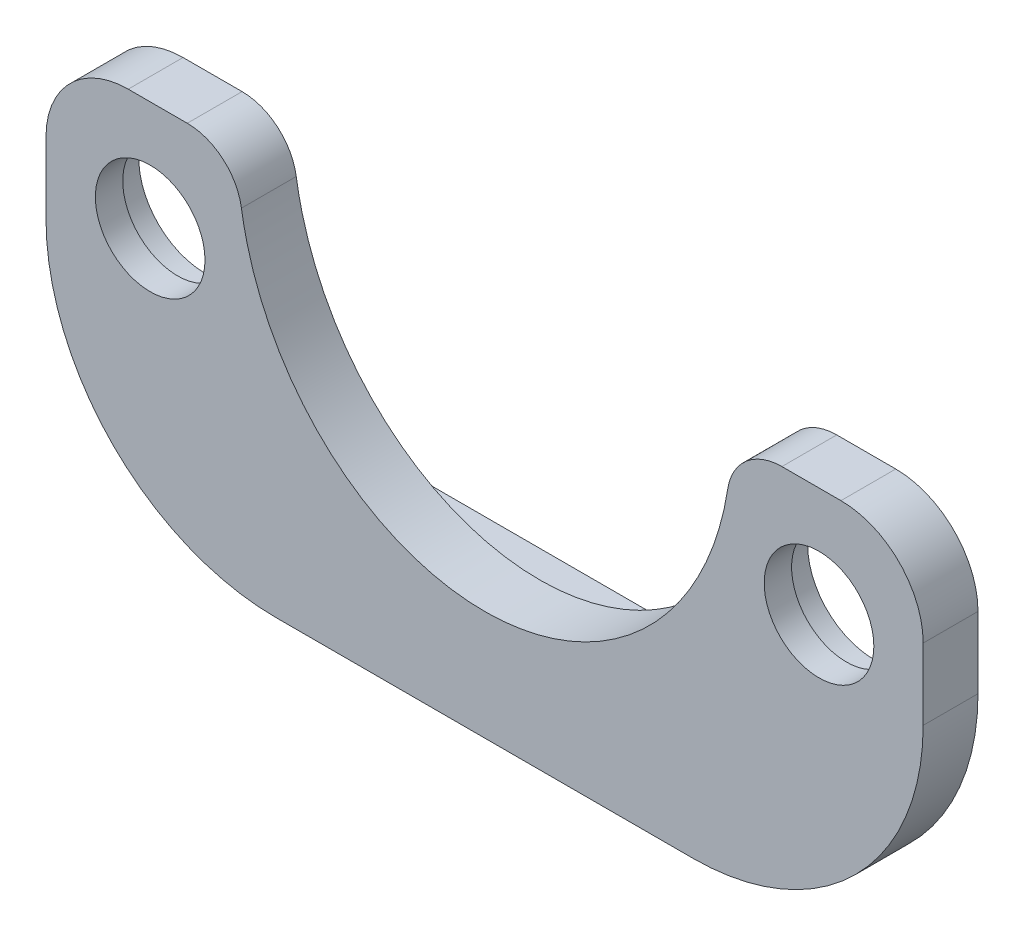
ISO-10303-21;
HEADER;
FILE_DESCRIPTION(('STEP AP214'),'2;1');
FILE_NAME('part.step','',(''),(''),'','','');
FILE_SCHEMA(('AUTOMOTIVE_DESIGN { 1 0 10303 214 1 1 1 1 }'));
ENDSEC;
DATA;
#1=APPLICATION_CONTEXT('core data for automotive mechanical design processes');
#2=APPLICATION_PROTOCOL_DEFINITION('international standard','automotive_design',2000,#1);
#3=PRODUCT_CONTEXT('',#1,'mechanical');
#4=PRODUCT('Part','Part','',(#3));
#5=PRODUCT_RELATED_PRODUCT_CATEGORY('part','',(#4));
#6=PRODUCT_DEFINITION_FORMATION('','',#4);
#7=PRODUCT_DEFINITION_CONTEXT('part definition',#1,'design');
#8=PRODUCT_DEFINITION('design','',#6,#7);
#9=PRODUCT_DEFINITION_SHAPE('','',#8);
#10=(LENGTH_UNIT() NAMED_UNIT(*) SI_UNIT(.MILLI.,.METRE.));
#11=(NAMED_UNIT(*) PLANE_ANGLE_UNIT() SI_UNIT($,.RADIAN.));
#12=(NAMED_UNIT(*) SI_UNIT($,.STERADIAN.) SOLID_ANGLE_UNIT());
#13=UNCERTAINTY_MEASURE_WITH_UNIT(LENGTH_MEASURE(1.E-05),#10,'distance_accuracy_value','');
#14=(GEOMETRIC_REPRESENTATION_CONTEXT(3) GLOBAL_UNCERTAINTY_ASSIGNED_CONTEXT((#13)) GLOBAL_UNIT_ASSIGNED_CONTEXT((#10,
#11,#12)) REPRESENTATION_CONTEXT('',''));
#15=CARTESIAN_POINT('',(0.,0.,0.));
#16=DIRECTION('',(0.,0.,1.));
#17=DIRECTION('',(1.,0.,0.));
#18=AXIS2_PLACEMENT_3D('',#15,#16,#17);
#19=CARTESIAN_POINT('',(80.,70.,0.));
#20=DIRECTION('',(0.,0.,1.));
#21=DIRECTION('',(1.,0.,0.));
#22=AXIS2_PLACEMENT_3D('',#19,#20,#21);
#23=PLANE('',#22);
#24=CARTESIAN_POINT('',(19.,50.,0.));
#25=DIRECTION('',(0.,0.,1.));
#26=DIRECTION('',(1.,0.,0.));
#27=AXIS2_PLACEMENT_3D('',#24,#25,#26);
#28=CIRCLE('',#27,12.075);
#29=CARTESIAN_POINT('',(31.075,50.,0.));
#30=VERTEX_POINT('',#29);
#31=EDGE_CURVE('E204',#30,#30,#28,.T.);
#32=ORIENTED_EDGE('',*,*,#31,.T.);
#33=EDGE_LOOP('',(#32));
#34=FACE_BOUND('',#33,.T.);
#35=CARTESIAN_POINT('',(141.,50.,0.));
#36=DIRECTION('',(0.,0.,1.));
#37=DIRECTION('',(-1.,0.,0.));
#38=AXIS2_PLACEMENT_3D('',#35,#36,#37);
#39=CIRCLE('',#38,12.075);
#40=CARTESIAN_POINT('',(128.925,50.,0.));
#41=VERTEX_POINT('',#40);
#42=EDGE_CURVE('E207',#41,#41,#39,.T.);
#43=ORIENTED_EDGE('',*,*,#42,.T.);
#44=EDGE_LOOP('',(#43));
#45=FACE_BOUND('',#44,.T.);
#46=DIRECTION('',(0.,-1.,0.));
#47=VECTOR('',#46,1.);
#48=CARTESIAN_POINT('',(120.,0.,0.));
#49=LINE('',#48,#47);
#50=CARTESIAN_POINT('',(120.,4.99999999999999,0.));
#51=VERTEX_POINT('',#50);
#52=CARTESIAN_POINT('',(120.,0.0476460731939493,0.));
#53=VERTEX_POINT('',#52);
#54=EDGE_CURVE('E52',#51,#53,#49,.T.);
#55=ORIENTED_EDGE('',*,*,#54,.F.);
#56=DIRECTION('',(1.,0.,0.));
#57=VECTOR('',#56,1.);
#58=CARTESIAN_POINT('',(120.,4.99999999999999,0.));
#59=LINE('',#58,#57);
#60=CARTESIAN_POINT('',(40.,4.99999999999999,0.));
#61=VERTEX_POINT('',#60);
#62=EDGE_CURVE('E175',#61,#51,#59,.T.);
#63=ORIENTED_EDGE('',*,*,#62,.F.);
#64=DIRECTION('',(0.,1.,0.));
#65=VECTOR('',#64,1.);
#66=CARTESIAN_POINT('',(40.,0.,0.));
#67=LINE('',#66,#65);
#68=CARTESIAN_POINT('',(40.,0.0476460731939285,0.));
#69=VERTEX_POINT('',#68);
#70=EDGE_CURVE('E11',#69,#61,#67,.T.);
#71=ORIENTED_EDGE('',*,*,#70,.F.);
#72=CARTESIAN_POINT('',(42.,42.,0.));
#73=DIRECTION('',(0.,0.,1.));
#74=DIRECTION('',(-1.,0.,0.));
#75=AXIS2_PLACEMENT_3D('',#72,#73,#74);
#76=CIRCLE('',#75,42.);
#77=CARTESIAN_POINT('',(0.,42.,0.));
#78=VERTEX_POINT('',#77);
#79=EDGE_CURVE('E314',#78,#69,#76,.T.);
#80=ORIENTED_EDGE('',*,*,#79,.F.);
#81=DIRECTION('',(0.,-1.,0.));
#82=VECTOR('',#81,1.);
#83=CARTESIAN_POINT('',(0.,42.,0.));
#84=LINE('',#83,#82);
#85=CARTESIAN_POINT('',(0.,55.,0.));
#86=VERTEX_POINT('',#85);
#87=EDGE_CURVE('E308',#86,#78,#84,.T.);
#88=ORIENTED_EDGE('',*,*,#87,.F.);
#89=CARTESIAN_POINT('',(15.,55.,0.));
#90=DIRECTION('',(0.,0.,1.));
#91=DIRECTION('',(-1.,0.,0.));
#92=AXIS2_PLACEMENT_3D('',#89,#90,#91);
#93=CIRCLE('',#92,15.);
#94=CARTESIAN_POINT('',(15.,70.,0.));
#95=VERTEX_POINT('',#94);
#96=EDGE_CURVE('E299',#95,#86,#93,.T.);
#97=ORIENTED_EDGE('',*,*,#96,.F.);
#98=DIRECTION('',(-1.,0.,0.));
#99=VECTOR('',#98,1.);
#100=CARTESIAN_POINT('',(15.,70.,0.));
#101=LINE('',#100,#99);
#102=CARTESIAN_POINT('',(25.7681059066622,70.0000000000001,0.));
#103=VERTEX_POINT('',#102);
#104=EDGE_CURVE('E290',#103,#95,#101,.T.);
#105=ORIENTED_EDGE('',*,*,#104,.F.);
#106=CARTESIAN_POINT('',(25.7681059066622,60.0000000000002,0.));
#107=DIRECTION('',(0.,0.,1.));
#108=DIRECTION('',(1.,0.,0.));
#109=AXIS2_PLACEMENT_3D('',#106,#107,#108);
#110=CIRCLE('',#109,9.9999999999999);
#111=CARTESIAN_POINT('',(35.6505284769223,61.5289617859232,0.));
#112=VERTEX_POINT('',#111);
#113=EDGE_CURVE('E300',#112,#103,#110,.T.);
#114=ORIENTED_EDGE('',*,*,#113,.F.);
#115=CARTESIAN_POINT('',(80.,70.,0.));
#116=DIRECTION('',(0.,0.,-1.));
#117=DIRECTION('',(0.,-1.,0.));
#118=AXIS2_PLACEMENT_3D('',#115,#116,#117);
#119=ELLIPSE('',#118,50.,45.);
#120=CARTESIAN_POINT('',(124.349471523078,61.5289617859232,0.));
#121=VERTEX_POINT('',#120);
#122=EDGE_CURVE('E362',#121,#112,#119,.T.);
#123=ORIENTED_EDGE('',*,*,#122,.F.);
#124=CARTESIAN_POINT('',(134.231894093338,60.0000000000002,0.));
#125=DIRECTION('',(0.,0.,1.));
#126=DIRECTION('',(-1.,0.,0.));
#127=AXIS2_PLACEMENT_3D('',#124,#125,#126);
#128=CIRCLE('',#127,9.99999999999988);
#129=CARTESIAN_POINT('',(134.231894093338,70.,0.));
#130=VERTEX_POINT('',#129);
#131=EDGE_CURVE('E356',#130,#121,#128,.T.);
#132=ORIENTED_EDGE('',*,*,#131,.F.);
#133=DIRECTION('',(-1.,0.,0.));
#134=VECTOR('',#133,1.);
#135=CARTESIAN_POINT('',(134.231894093338,70.,0.));
#136=LINE('',#135,#134);
#137=CARTESIAN_POINT('',(145.,70.,0.));
#138=VERTEX_POINT('',#137);
#139=EDGE_CURVE('E350',#138,#130,#136,.T.);
#140=ORIENTED_EDGE('',*,*,#139,.F.);
#141=CARTESIAN_POINT('',(145.,55.,0.));
#142=DIRECTION('',(0.,0.,1.));
#143=DIRECTION('',(-1.,0.,0.));
#144=AXIS2_PLACEMENT_3D('',#141,#142,#143);
#145=CIRCLE('',#144,15.);
#146=CARTESIAN_POINT('',(160.,55.,0.));
#147=VERTEX_POINT('',#146);
#148=EDGE_CURVE('E210',#147,#138,#145,.T.);
#149=ORIENTED_EDGE('',*,*,#148,.F.);
#150=DIRECTION('',(0.,1.,0.));
#151=VECTOR('',#150,1.);
#152=CARTESIAN_POINT('',(160.,42.,0.));
#153=LINE('',#152,#151);
#154=CARTESIAN_POINT('',(160.,42.,0.));
#155=VERTEX_POINT('',#154);
#156=EDGE_CURVE('E215',#155,#147,#153,.T.);
#157=ORIENTED_EDGE('',*,*,#156,.F.);
#158=CARTESIAN_POINT('',(118.,42.,0.));
#159=DIRECTION('',(0.,0.,1.));
#160=DIRECTION('',(1.,0.,0.));
#161=AXIS2_PLACEMENT_3D('',#158,#159,#160);
#162=CIRCLE('',#161,42.);
#163=EDGE_CURVE('E316',#53,#155,#162,.T.);
#164=ORIENTED_EDGE('',*,*,#163,.F.);
#165=EDGE_LOOP('',(#55,#63,#71,#80,#88,#97,#105,#114,#123,#132,#140,#149,#157,#164));
#166=FACE_BOUND('',#165,.T.);
#167=ADVANCED_FACE('F35',(#34,#45,#166),#23,.F.);
#168=CARTESIAN_POINT('',(19.,50.,10.));
#169=DIRECTION('',(0.,0.,-1.));
#170=DIRECTION('',(-1.,0.,0.));
#171=AXIS2_PLACEMENT_3D('',#168,#169,#170);
#172=CYLINDRICAL_SURFACE('',#171,12.075);
#173=ORIENTED_EDGE('',*,*,#31,.F.);
#174=EDGE_LOOP('',(#173));
#175=FACE_BOUND('',#174,.T.);
#176=CARTESIAN_POINT('',(19.,50.,5.));
#177=DIRECTION('',(0.,0.,1.));
#178=DIRECTION('',(1.,0.,0.));
#179=AXIS2_PLACEMENT_3D('',#176,#177,#178);
#180=CIRCLE('',#179,12.075);
#181=CARTESIAN_POINT('',(31.075,50.,5.));
#182=VERTEX_POINT('',#181);
#183=EDGE_CURVE('E191',#182,#182,#180,.T.);
#184=ORIENTED_EDGE('',*,*,#183,.T.);
#185=EDGE_LOOP('',(#184));
#186=FACE_BOUND('',#185,.T.);
#187=ADVANCED_FACE('F244',(#175,#186),#172,.F.);
#188=CARTESIAN_POINT('',(141.,50.,10.));
#189=DIRECTION('',(0.,0.,-1.));
#190=DIRECTION('',(-1.,0.,0.));
#191=AXIS2_PLACEMENT_3D('',#188,#189,#190);
#192=CYLINDRICAL_SURFACE('',#191,12.075);
#193=ORIENTED_EDGE('',*,*,#42,.F.);
#194=EDGE_LOOP('',(#193));
#195=FACE_BOUND('',#194,.T.);
#196=CARTESIAN_POINT('',(141.,50.,5.));
#197=DIRECTION('',(0.,0.,1.));
#198=DIRECTION('',(1.,0.,0.));
#199=AXIS2_PLACEMENT_3D('',#196,#197,#198);
#200=CIRCLE('',#199,12.075);
#201=CARTESIAN_POINT('',(153.075,50.,5.));
#202=VERTEX_POINT('',#201);
#203=EDGE_CURVE('E199',#202,#202,#200,.T.);
#204=ORIENTED_EDGE('',*,*,#203,.T.);
#205=EDGE_LOOP('',(#204));
#206=FACE_BOUND('',#205,.T.);
#207=ADVANCED_FACE('F250',(#195,#206),#192,.F.);
#208=CARTESIAN_POINT('',(80.,70.,10.));
#209=DIRECTION('',(0.,0.,1.));
#210=DIRECTION('',(1.,0.,0.));
#211=AXIS2_PLACEMENT_3D('',#208,#209,#210);
#212=PLANE('',#211);
#213=CARTESIAN_POINT('',(145.,55.,10.));
#214=DIRECTION('',(0.,0.,1.));
#215=DIRECTION('',(-1.,0.,0.));
#216=AXIS2_PLACEMENT_3D('',#213,#214,#215);
#217=CIRCLE('',#216,15.);
#218=CARTESIAN_POINT('',(160.,55.,10.));
#219=VERTEX_POINT('',#218);
#220=CARTESIAN_POINT('',(145.,70.,10.));
#221=VERTEX_POINT('',#220);
#222=EDGE_CURVE('E211',#219,#221,#217,.T.);
#223=ORIENTED_EDGE('',*,*,#222,.T.);
#224=DIRECTION('',(-1.,0.,0.));
#225=VECTOR('',#224,1.);
#226=CARTESIAN_POINT('',(134.231894093338,70.,10.));
#227=LINE('',#226,#225);
#228=CARTESIAN_POINT('',(134.231894093338,70.,10.));
#229=VERTEX_POINT('',#228);
#230=EDGE_CURVE('E214',#221,#229,#227,.T.);
#231=ORIENTED_EDGE('',*,*,#230,.T.);
#232=CARTESIAN_POINT('',(134.231894093338,60.0000000000002,10.));
#233=DIRECTION('',(0.,0.,1.));
#234=DIRECTION('',(-1.,0.,0.));
#235=AXIS2_PLACEMENT_3D('',#232,#233,#234);
#236=CIRCLE('',#235,9.99999999999988);
#237=CARTESIAN_POINT('',(124.349471523078,61.5289617859232,10.));
#238=VERTEX_POINT('',#237);
#239=EDGE_CURVE('E217',#229,#238,#236,.T.);
#240=ORIENTED_EDGE('',*,*,#239,.T.);
#241=CARTESIAN_POINT('',(80.,70.,10.));
#242=DIRECTION('',(0.,0.,-1.));
#243=DIRECTION('',(0.,-1.,0.));
#244=AXIS2_PLACEMENT_3D('',#241,#242,#243);
#245=ELLIPSE('',#244,50.,45.);
#246=CARTESIAN_POINT('',(35.6505284769223,61.5289617859232,10.));
#247=VERTEX_POINT('',#246);
#248=EDGE_CURVE('E219',#238,#247,#245,.T.);
#249=ORIENTED_EDGE('',*,*,#248,.T.);
#250=CARTESIAN_POINT('',(25.7681059066622,60.0000000000002,10.));
#251=DIRECTION('',(0.,0.,1.));
#252=DIRECTION('',(1.,0.,0.));
#253=AXIS2_PLACEMENT_3D('',#250,#251,#252);
#254=CIRCLE('',#253,9.9999999999999);
#255=CARTESIAN_POINT('',(25.7681059066622,70.0000000000001,10.));
#256=VERTEX_POINT('',#255);
#257=EDGE_CURVE('E222',#247,#256,#254,.T.);
#258=ORIENTED_EDGE('',*,*,#257,.T.);
#259=DIRECTION('',(-1.,0.,0.));
#260=VECTOR('',#259,1.);
#261=CARTESIAN_POINT('',(15.,70.,10.));
#262=LINE('',#261,#260);
#263=CARTESIAN_POINT('',(15.,70.,10.));
#264=VERTEX_POINT('',#263);
#265=EDGE_CURVE('E410',#256,#264,#262,.T.);
#266=ORIENTED_EDGE('',*,*,#265,.T.);
#267=CARTESIAN_POINT('',(15.,55.,10.));
#268=DIRECTION('',(0.,0.,1.));
#269=DIRECTION('',(-1.,0.,0.));
#270=AXIS2_PLACEMENT_3D('',#267,#268,#269);
#271=CIRCLE('',#270,15.);
#272=CARTESIAN_POINT('',(0.,55.,10.));
#273=VERTEX_POINT('',#272);
#274=EDGE_CURVE('E304',#264,#273,#271,.T.);
#275=ORIENTED_EDGE('',*,*,#274,.T.);
#276=DIRECTION('',(0.,-1.,0.));
#277=VECTOR('',#276,1.);
#278=CARTESIAN_POINT('',(0.,42.,10.));
#279=LINE('',#278,#277);
#280=CARTESIAN_POINT('',(0.,42.,10.));
#281=VERTEX_POINT('',#280);
#282=EDGE_CURVE('E406',#273,#281,#279,.T.);
#283=ORIENTED_EDGE('',*,*,#282,.T.);
#284=CARTESIAN_POINT('',(42.,42.,10.));
#285=DIRECTION('',(0.,0.,1.));
#286=DIRECTION('',(-1.,0.,0.));
#287=AXIS2_PLACEMENT_3D('',#284,#285,#286);
#288=CIRCLE('',#287,42.);
#289=CARTESIAN_POINT('',(42.,0.,10.));
#290=VERTEX_POINT('',#289);
#291=EDGE_CURVE('E404',#281,#290,#288,.T.);
#292=ORIENTED_EDGE('',*,*,#291,.T.);
#293=DIRECTION('',(1.,0.,0.));
#294=VECTOR('',#293,1.);
#295=CARTESIAN_POINT('',(42.,0.,10.));
#296=LINE('',#295,#294);
#297=CARTESIAN_POINT('',(118.,0.,10.));
#298=VERTEX_POINT('',#297);
#299=EDGE_CURVE('E403',#290,#298,#296,.T.);
#300=ORIENTED_EDGE('',*,*,#299,.T.);
#301=CARTESIAN_POINT('',(118.,42.,10.));
#302=DIRECTION('',(0.,0.,1.));
#303=DIRECTION('',(1.,0.,0.));
#304=AXIS2_PLACEMENT_3D('',#301,#302,#303);
#305=CIRCLE('',#304,42.);
#306=CARTESIAN_POINT('',(160.,42.,10.));
#307=VERTEX_POINT('',#306);
#308=EDGE_CURVE('E372',#298,#307,#305,.T.);
#309=ORIENTED_EDGE('',*,*,#308,.T.);
#310=DIRECTION('',(0.,1.,0.));
#311=VECTOR('',#310,1.);
#312=CARTESIAN_POINT('',(160.,42.,10.));
#313=LINE('',#312,#311);
#314=EDGE_CURVE('E325',#307,#219,#313,.T.);
#315=ORIENTED_EDGE('',*,*,#314,.T.);
#316=EDGE_LOOP('',(#223,#231,#240,#249,#258,#266,#275,#283,#292,#300,#309,#315));
#317=FACE_BOUND('',#316,.T.);
#318=CARTESIAN_POINT('',(141.,50.,10.));
#319=DIRECTION('',(0.,0.,1.));
#320=DIRECTION('',(1.,0.,0.));
#321=AXIS2_PLACEMENT_3D('',#318,#319,#320);
#322=CIRCLE('',#321,10.);
#323=CARTESIAN_POINT('',(151.,50.,10.));
#324=VERTEX_POINT('',#323);
#325=EDGE_CURVE('E195',#324,#324,#322,.T.);
#326=ORIENTED_EDGE('',*,*,#325,.F.);
#327=EDGE_LOOP('',(#326));
#328=FACE_BOUND('',#327,.T.);
#329=CARTESIAN_POINT('',(19.,50.,10.));
#330=DIRECTION('',(0.,0.,1.));
#331=DIRECTION('',(1.,0.,0.));
#332=AXIS2_PLACEMENT_3D('',#329,#330,#331);
#333=CIRCLE('',#332,10.);
#334=CARTESIAN_POINT('',(29.,50.,10.));
#335=VERTEX_POINT('',#334);
#336=EDGE_CURVE('E181',#335,#335,#333,.T.);
#337=ORIENTED_EDGE('',*,*,#336,.F.);
#338=EDGE_LOOP('',(#337));
#339=FACE_BOUND('',#338,.T.);
#340=ADVANCED_FACE('F241',(#317,#328,#339),#212,.T.);
#341=CARTESIAN_POINT('',(145.,55.,10.));
#342=DIRECTION('',(0.,0.,-1.));
#343=DIRECTION('',(-1.,0.,0.));
#344=AXIS2_PLACEMENT_3D('',#341,#342,#343);
#345=CYLINDRICAL_SURFACE('',#344,15.);
#346=ORIENTED_EDGE('',*,*,#148,.T.);
#347=DIRECTION('',(0.,0.,-1.));
#348=VECTOR('',#347,1.);
#349=CARTESIAN_POINT('',(145.,70.,10.));
#350=LINE('',#349,#348);
#351=EDGE_CURVE('E39',#221,#138,#350,.T.);
#352=ORIENTED_EDGE('',*,*,#351,.F.);
#353=ORIENTED_EDGE('',*,*,#222,.F.);
#354=DIRECTION('',(0.,0.,-1.));
#355=VECTOR('',#354,1.);
#356=CARTESIAN_POINT('',(160.,55.,10.));
#357=LINE('',#356,#355);
#358=EDGE_CURVE('E321',#219,#147,#357,.T.);
#359=ORIENTED_EDGE('',*,*,#358,.T.);
#360=EDGE_LOOP('',(#346,#352,#353,#359));
#361=FACE_BOUND('',#360,.T.);
#362=ADVANCED_FACE('F37',(#361),#345,.T.);
#363=CARTESIAN_POINT('',(134.231894093338,70.,10.));
#364=DIRECTION('',(0.,-1.,0.));
#365=DIRECTION('',(1.,0.,0.));
#366=AXIS2_PLACEMENT_3D('',#363,#364,#365);
#367=PLANE('',#366);
#368=ORIENTED_EDGE('',*,*,#139,.T.);
#369=DIRECTION('',(0.,0.,-1.));
#370=VECTOR('',#369,1.);
#371=CARTESIAN_POINT('',(134.231894093338,70.,10.));
#372=LINE('',#371,#370);
#373=EDGE_CURVE('E342',#229,#130,#372,.T.);
#374=ORIENTED_EDGE('',*,*,#373,.F.);
#375=ORIENTED_EDGE('',*,*,#230,.F.);
#376=ORIENTED_EDGE('',*,*,#351,.T.);
#377=EDGE_LOOP('',(#368,#374,#375,#376));
#378=FACE_BOUND('',#377,.T.);
#379=ADVANCED_FACE('F234',(#378),#367,.F.);
#380=CARTESIAN_POINT('',(134.231894093338,60.0000000000002,10.));
#381=DIRECTION('',(0.,0.,-1.));
#382=DIRECTION('',(-1.,0.,0.));
#383=AXIS2_PLACEMENT_3D('',#380,#381,#382);
#384=CYLINDRICAL_SURFACE('',#383,9.99999999999988);
#385=ORIENTED_EDGE('',*,*,#131,.T.);
#386=DIRECTION('',(0.,0.,-1.));
#387=VECTOR('',#386,1.);
#388=CARTESIAN_POINT('',(124.349471523078,61.5289617859232,10.));
#389=LINE('',#388,#387);
#390=EDGE_CURVE('E340',#238,#121,#389,.T.);
#391=ORIENTED_EDGE('',*,*,#390,.F.);
#392=ORIENTED_EDGE('',*,*,#239,.F.);
#393=ORIENTED_EDGE('',*,*,#373,.T.);
#394=EDGE_LOOP('',(#385,#391,#392,#393));
#395=FACE_BOUND('',#394,.T.);
#396=ADVANCED_FACE('F230',(#395),#384,.T.);
#397=DIRECTION('',(0.,0.,-1.));
#398=VECTOR('',#397,1.);
#399=SURFACE_OF_LINEAR_EXTRUSION('',#245,#398);
#400=ORIENTED_EDGE('',*,*,#122,.T.);
#401=DIRECTION('',(0.,0.,-1.));
#402=VECTOR('',#401,1.);
#403=CARTESIAN_POINT('',(35.6505284769223,61.5289617859232,10.));
#404=LINE('',#403,#402);
#405=EDGE_CURVE('E337',#247,#112,#404,.T.);
#406=ORIENTED_EDGE('',*,*,#405,.F.);
#407=ORIENTED_EDGE('',*,*,#248,.F.);
#408=ORIENTED_EDGE('',*,*,#390,.T.);
#409=EDGE_LOOP('',(#400,#406,#407,#408));
#410=FACE_BOUND('',#409,.T.);
#411=ADVANCED_FACE('F225',(#410),#399,.F.);
#412=CARTESIAN_POINT('',(25.7681059066622,60.0000000000002,10.));
#413=DIRECTION('',(0.,0.,-1.));
#414=DIRECTION('',(-1.,0.,0.));
#415=AXIS2_PLACEMENT_3D('',#412,#413,#414);
#416=CYLINDRICAL_SURFACE('',#415,9.9999999999999);
#417=ORIENTED_EDGE('',*,*,#113,.T.);
#418=DIRECTION('',(0.,0.,-1.));
#419=VECTOR('',#418,1.);
#420=CARTESIAN_POINT('',(25.7681059066622,70.0000000000001,10.));
#421=LINE('',#420,#419);
#422=EDGE_CURVE('E296',#256,#103,#421,.T.);
#423=ORIENTED_EDGE('',*,*,#422,.F.);
#424=ORIENTED_EDGE('',*,*,#257,.F.);
#425=ORIENTED_EDGE('',*,*,#405,.T.);
#426=EDGE_LOOP('',(#417,#423,#424,#425));
#427=FACE_BOUND('',#426,.T.);
#428=ADVANCED_FACE('F229',(#427),#416,.T.);
#429=CARTESIAN_POINT('',(15.,70.,10.));
#430=DIRECTION('',(0.,-1.,0.));
#431=DIRECTION('',(0.,0.,-1.));
#432=AXIS2_PLACEMENT_3D('',#429,#430,#431);
#433=PLANE('',#432);
#434=ORIENTED_EDGE('',*,*,#104,.T.);
#435=DIRECTION('',(0.,0.,-1.));
#436=VECTOR('',#435,1.);
#437=CARTESIAN_POINT('',(15.,70.,10.));
#438=LINE('',#437,#436);
#439=EDGE_CURVE('E293',#264,#95,#438,.T.);
#440=ORIENTED_EDGE('',*,*,#439,.F.);
#441=ORIENTED_EDGE('',*,*,#265,.F.);
#442=ORIENTED_EDGE('',*,*,#422,.T.);
#443=EDGE_LOOP('',(#434,#440,#441,#442));
#444=FACE_BOUND('',#443,.T.);
#445=ADVANCED_FACE('F279',(#444),#433,.F.);
#446=CARTESIAN_POINT('',(15.,55.,10.));
#447=DIRECTION('',(0.,0.,-1.));
#448=DIRECTION('',(-1.,0.,0.));
#449=AXIS2_PLACEMENT_3D('',#446,#447,#448);
#450=CYLINDRICAL_SURFACE('',#449,15.);
#451=ORIENTED_EDGE('',*,*,#96,.T.);
#452=DIRECTION('',(0.,0.,-1.));
#453=VECTOR('',#452,1.);
#454=CARTESIAN_POINT('',(0.,55.,10.));
#455=LINE('',#454,#453);
#456=EDGE_CURVE('E305',#273,#86,#455,.T.);
#457=ORIENTED_EDGE('',*,*,#456,.F.);
#458=ORIENTED_EDGE('',*,*,#274,.F.);
#459=ORIENTED_EDGE('',*,*,#439,.T.);
#460=EDGE_LOOP('',(#451,#457,#458,#459));
#461=FACE_BOUND('',#460,.T.);
#462=ADVANCED_FACE('F276',(#461),#450,.T.);
#463=CARTESIAN_POINT('',(0.,42.,10.));
#464=DIRECTION('',(1.,0.,0.));
#465=DIRECTION('',(0.,0.,-1.));
#466=AXIS2_PLACEMENT_3D('',#463,#464,#465);
#467=PLANE('',#466);
#468=ORIENTED_EDGE('',*,*,#87,.T.);
#469=DIRECTION('',(0.,0.,-1.));
#470=VECTOR('',#469,1.);
#471=CARTESIAN_POINT('',(0.,42.,10.));
#472=LINE('',#471,#470);
#473=EDGE_CURVE('E332',#281,#78,#472,.T.);
#474=ORIENTED_EDGE('',*,*,#473,.F.);
#475=ORIENTED_EDGE('',*,*,#282,.F.);
#476=ORIENTED_EDGE('',*,*,#456,.T.);
#477=EDGE_LOOP('',(#468,#474,#475,#476));
#478=FACE_BOUND('',#477,.T.);
#479=ADVANCED_FACE('F272',(#478),#467,.F.);
#480=CARTESIAN_POINT('',(42.,42.,10.));
#481=DIRECTION('',(0.,0.,-1.));
#482=DIRECTION('',(-1.,0.,0.));
#483=AXIS2_PLACEMENT_3D('',#480,#481,#482);
#484=CYLINDRICAL_SURFACE('',#483,42.);
#485=ORIENTED_EDGE('',*,*,#79,.T.);
#486=CARTESIAN_POINT('',(42.,0.,0.));
#487=VERTEX_POINT('',#486);
#488=EDGE_CURVE('E310',#69,#487,#76,.T.);
#489=ORIENTED_EDGE('',*,*,#488,.T.);
#490=DIRECTION('',(0.,0.,-1.));
#491=VECTOR('',#490,1.);
#492=CARTESIAN_POINT('',(42.,0.,10.));
#493=LINE('',#492,#491);
#494=EDGE_CURVE('E330',#290,#487,#493,.T.);
#495=ORIENTED_EDGE('',*,*,#494,.F.);
#496=ORIENTED_EDGE('',*,*,#291,.F.);
#497=ORIENTED_EDGE('',*,*,#473,.T.);
#498=EDGE_LOOP('',(#485,#489,#495,#496,#497));
#499=FACE_BOUND('',#498,.T.);
#500=ADVANCED_FACE('F268',(#499),#484,.T.);
#501=CARTESIAN_POINT('',(42.,0.,10.));
#502=DIRECTION('',(0.,1.,0.));
#503=DIRECTION('',(-1.,0.,0.));
#504=AXIS2_PLACEMENT_3D('',#501,#502,#503);
#505=PLANE('',#504);
#506=CARTESIAN_POINT('',(100.,0.,-10.));
#507=DIRECTION('',(0.,1.,0.));
#508=DIRECTION('',(0.,0.,1.));
#509=AXIS2_PLACEMENT_3D('',#506,#507,#508);
#510=CIRCLE('',#509,2.57499999999999);
#511=CARTESIAN_POINT('',(100.,0.,-7.42500000000001));
#512=VERTEX_POINT('',#511);
#513=EDGE_CURVE('E379',#512,#512,#510,.T.);
#514=ORIENTED_EDGE('',*,*,#513,.T.);
#515=EDGE_LOOP('',(#514));
#516=FACE_BOUND('',#515,.T.);
#517=CARTESIAN_POINT('',(60.,0.,-10.));
#518=DIRECTION('',(0.,1.,0.));
#519=DIRECTION('',(0.,0.,-1.));
#520=AXIS2_PLACEMENT_3D('',#517,#518,#519);
#521=CIRCLE('',#520,2.57499999999999);
#522=CARTESIAN_POINT('',(60.,0.,-12.575));
#523=VERTEX_POINT('',#522);
#524=EDGE_CURVE('E618',#523,#523,#521,.T.);
#525=ORIENTED_EDGE('',*,*,#524,.T.);
#526=EDGE_LOOP('',(#525));
#527=FACE_BOUND('',#526,.T.);
#528=ORIENTED_EDGE('',*,*,#494,.T.);
#529=DIRECTION('',(-1.,0.,0.));
#530=VECTOR('',#529,1.);
#531=CARTESIAN_POINT('',(120.,0.,0.));
#532=LINE('',#531,#530);
#533=CARTESIAN_POINT('',(40.,0.,0.));
#534=VERTEX_POINT('',#533);
#535=EDGE_CURVE('E382',#487,#534,#532,.T.);
#536=ORIENTED_EDGE('',*,*,#535,.T.);
#537=DIRECTION('',(0.,0.,1.));
#538=VECTOR('',#537,1.);
#539=CARTESIAN_POINT('',(40.,0.,-20.));
#540=LINE('',#539,#538);
#541=CARTESIAN_POINT('',(40.,0.,-20.));
#542=VERTEX_POINT('',#541);
#543=EDGE_CURVE('E162',#542,#534,#540,.T.);
#544=ORIENTED_EDGE('',*,*,#543,.F.);
#545=DIRECTION('',(-1.,0.,0.));
#546=VECTOR('',#545,1.);
#547=CARTESIAN_POINT('',(120.,0.,-20.));
#548=LINE('',#547,#546);
#549=CARTESIAN_POINT('',(120.,0.,-20.));
#550=VERTEX_POINT('',#549);
#551=EDGE_CURVE('E154',#550,#542,#548,.T.);
#552=ORIENTED_EDGE('',*,*,#551,.F.);
#553=DIRECTION('',(0.,0.,1.));
#554=VECTOR('',#553,1.);
#555=CARTESIAN_POINT('',(120.,0.,-20.));
#556=LINE('',#555,#554);
#557=CARTESIAN_POINT('',(120.,0.,0.));
#558=VERTEX_POINT('',#557);
#559=EDGE_CURVE('E160',#550,#558,#556,.T.);
#560=ORIENTED_EDGE('',*,*,#559,.T.);
#561=CARTESIAN_POINT('',(118.,0.,0.));
#562=VERTEX_POINT('',#561);
#563=EDGE_CURVE('E378',#558,#562,#532,.T.);
#564=ORIENTED_EDGE('',*,*,#563,.T.);
#565=DIRECTION('',(0.,0.,-1.));
#566=VECTOR('',#565,1.);
#567=CARTESIAN_POINT('',(118.,0.,10.));
#568=LINE('',#567,#566);
#569=EDGE_CURVE('E328',#298,#562,#568,.T.);
#570=ORIENTED_EDGE('',*,*,#569,.F.);
#571=ORIENTED_EDGE('',*,*,#299,.F.);
#572=EDGE_LOOP('',(#528,#536,#544,#552,#560,#564,#570,#571));
#573=FACE_BOUND('',#572,.T.);
#574=ADVANCED_FACE('F157',(#516,#527,#573),#505,.F.);
#575=CARTESIAN_POINT('',(118.,42.,10.));
#576=DIRECTION('',(0.,0.,-1.));
#577=DIRECTION('',(-1.,0.,0.));
#578=AXIS2_PLACEMENT_3D('',#575,#576,#577);
#579=CYLINDRICAL_SURFACE('',#578,42.);
#580=EDGE_CURVE('E317',#562,#53,#162,.T.);
#581=ORIENTED_EDGE('',*,*,#580,.T.);
#582=ORIENTED_EDGE('',*,*,#163,.T.);
#583=DIRECTION('',(0.,0.,-1.));
#584=VECTOR('',#583,1.);
#585=CARTESIAN_POINT('',(160.,42.,10.));
#586=LINE('',#585,#584);
#587=EDGE_CURVE('E324',#307,#155,#586,.T.);
#588=ORIENTED_EDGE('',*,*,#587,.F.);
#589=ORIENTED_EDGE('',*,*,#308,.F.);
#590=ORIENTED_EDGE('',*,*,#569,.T.);
#591=EDGE_LOOP('',(#581,#582,#588,#589,#590));
#592=FACE_BOUND('',#591,.T.);
#593=ADVANCED_FACE('F261',(#592),#579,.T.);
#594=CARTESIAN_POINT('',(160.,42.,10.));
#595=DIRECTION('',(-1.,0.,0.));
#596=DIRECTION('',(0.,0.,1.));
#597=AXIS2_PLACEMENT_3D('',#594,#595,#596);
#598=PLANE('',#597);
#599=ORIENTED_EDGE('',*,*,#156,.T.);
#600=ORIENTED_EDGE('',*,*,#358,.F.);
#601=ORIENTED_EDGE('',*,*,#314,.F.);
#602=ORIENTED_EDGE('',*,*,#587,.T.);
#603=EDGE_LOOP('',(#599,#600,#601,#602));
#604=FACE_BOUND('',#603,.T.);
#605=ADVANCED_FACE('F257',(#604),#598,.F.);
#606=CARTESIAN_POINT('',(141.,50.,5.));
#607=DIRECTION('',(0.,0.,1.));
#608=DIRECTION('',(1.,0.,0.));
#609=AXIS2_PLACEMENT_3D('',#606,#607,#608);
#610=PLANE('',#609);
#611=CARTESIAN_POINT('',(141.,50.,5.));
#612=DIRECTION('',(0.,0.,1.));
#613=DIRECTION('',(1.,0.,0.));
#614=AXIS2_PLACEMENT_3D('',#611,#612,#613);
#615=CIRCLE('',#614,10.);
#616=CARTESIAN_POINT('',(151.,50.,5.));
#617=VERTEX_POINT('',#616);
#618=EDGE_CURVE('E196',#617,#617,#615,.T.);
#619=ORIENTED_EDGE('',*,*,#618,.T.);
#620=EDGE_LOOP('',(#619));
#621=FACE_BOUND('',#620,.T.);
#622=ORIENTED_EDGE('',*,*,#203,.F.);
#623=EDGE_LOOP('',(#622));
#624=FACE_BOUND('',#623,.T.);
#625=ADVANCED_FACE('F260',(#621,#624),#610,.F.);
#626=CARTESIAN_POINT('',(141.,50.,5.));
#627=DIRECTION('',(0.,0.,1.));
#628=DIRECTION('',(1.,0.,0.));
#629=AXIS2_PLACEMENT_3D('',#626,#627,#628);
#630=CYLINDRICAL_SURFACE('',#629,10.);
#631=ORIENTED_EDGE('',*,*,#618,.F.);
#632=EDGE_LOOP('',(#631));
#633=FACE_BOUND('',#632,.T.);
#634=ORIENTED_EDGE('',*,*,#325,.T.);
#635=EDGE_LOOP('',(#634));
#636=FACE_BOUND('',#635,.T.);
#637=ADVANCED_FACE('F435',(#633,#636),#630,.F.);
#638=CARTESIAN_POINT('',(19.,50.,5.));
#639=DIRECTION('',(0.,0.,1.));
#640=DIRECTION('',(1.,0.,0.));
#641=AXIS2_PLACEMENT_3D('',#638,#639,#640);
#642=PLANE('',#641);
#643=CARTESIAN_POINT('',(19.,50.,5.));
#644=DIRECTION('',(0.,0.,1.));
#645=DIRECTION('',(1.,0.,0.));
#646=AXIS2_PLACEMENT_3D('',#643,#644,#645);
#647=CIRCLE('',#646,10.);
#648=CARTESIAN_POINT('',(29.,50.,5.));
#649=VERTEX_POINT('',#648);
#650=EDGE_CURVE('E184',#649,#649,#647,.T.);
#651=ORIENTED_EDGE('',*,*,#650,.T.);
#652=EDGE_LOOP('',(#651));
#653=FACE_BOUND('',#652,.T.);
#654=ORIENTED_EDGE('',*,*,#183,.F.);
#655=EDGE_LOOP('',(#654));
#656=FACE_BOUND('',#655,.T.);
#657=ADVANCED_FACE('F431',(#653,#656),#642,.F.);
#658=CARTESIAN_POINT('',(19.,50.,5.));
#659=DIRECTION('',(0.,0.,1.));
#660=DIRECTION('',(1.,0.,0.));
#661=AXIS2_PLACEMENT_3D('',#658,#659,#660);
#662=CYLINDRICAL_SURFACE('',#661,10.);
#663=ORIENTED_EDGE('',*,*,#650,.F.);
#664=EDGE_LOOP('',(#663));
#665=FACE_BOUND('',#664,.T.);
#666=ORIENTED_EDGE('',*,*,#336,.T.);
#667=EDGE_LOOP('',(#666));
#668=FACE_BOUND('',#667,.T.);
#669=ADVANCED_FACE('F420',(#665,#668),#662,.F.);
#670=CARTESIAN_POINT('',(0.,0.,0.));
#671=DIRECTION('',(0.,0.,1.));
#672=DIRECTION('',(1.,0.,0.));
#673=AXIS2_PLACEMENT_3D('',#670,#671,#672);
#674=PLANE('',#673);
#675=ORIENTED_EDGE('',*,*,#580,.F.);
#676=ORIENTED_EDGE('',*,*,#563,.F.);
#677=EDGE_CURVE('E179',#53,#558,#49,.T.);
#678=ORIENTED_EDGE('',*,*,#677,.F.);
#679=EDGE_LOOP('',(#675,#676,#678));
#680=FACE_BOUND('',#679,.T.);
#681=ADVANCED_FACE('F377',(#680),#674,.T.);
#682=ORIENTED_EDGE('',*,*,#488,.F.);
#683=EDGE_CURVE('E45',#534,#69,#67,.T.);
#684=ORIENTED_EDGE('',*,*,#683,.F.);
#685=ORIENTED_EDGE('',*,*,#535,.F.);
#686=EDGE_LOOP('',(#682,#684,#685));
#687=FACE_BOUND('',#686,.T.);
#688=ADVANCED_FACE('F399',(#687),#674,.T.);
#689=CARTESIAN_POINT('',(120.,0.,-20.));
#690=DIRECTION('',(-1.,0.,0.));
#691=DIRECTION('',(0.,0.,1.));
#692=AXIS2_PLACEMENT_3D('',#689,#690,#691);
#693=PLANE('',#692);
#694=ORIENTED_EDGE('',*,*,#54,.T.);
#695=ORIENTED_EDGE('',*,*,#677,.T.);
#696=ORIENTED_EDGE('',*,*,#559,.F.);
#697=DIRECTION('',(0.,-1.,0.));
#698=VECTOR('',#697,1.);
#699=CARTESIAN_POINT('',(120.,0.,-20.));
#700=LINE('',#699,#698);
#701=CARTESIAN_POINT('',(120.,4.99999999999999,-20.));
#702=VERTEX_POINT('',#701);
#703=EDGE_CURVE('E166',#702,#550,#700,.T.);
#704=ORIENTED_EDGE('',*,*,#703,.F.);
#705=DIRECTION('',(0.,0.,1.));
#706=VECTOR('',#705,1.);
#707=CARTESIAN_POINT('',(120.,4.99999999999999,-20.));
#708=LINE('',#707,#706);
#709=EDGE_CURVE('E381',#702,#51,#708,.T.);
#710=ORIENTED_EDGE('',*,*,#709,.T.);
#711=EDGE_LOOP('',(#694,#695,#696,#704,#710));
#712=FACE_BOUND('',#711,.T.);
#713=ADVANCED_FACE('F177',(#712),#693,.F.);
#714=CARTESIAN_POINT('',(40.,0.,-20.));
#715=DIRECTION('',(1.,0.,0.));
#716=DIRECTION('',(0.,1.,0.));
#717=AXIS2_PLACEMENT_3D('',#714,#715,#716);
#718=PLANE('',#717);
#719=ORIENTED_EDGE('',*,*,#683,.T.);
#720=ORIENTED_EDGE('',*,*,#70,.T.);
#721=DIRECTION('',(0.,0.,1.));
#722=VECTOR('',#721,1.);
#723=CARTESIAN_POINT('',(40.,4.99999999999999,-20.));
#724=LINE('',#723,#722);
#725=CARTESIAN_POINT('',(40.,4.99999999999999,-20.));
#726=VERTEX_POINT('',#725);
#727=EDGE_CURVE('E186',#726,#61,#724,.T.);
#728=ORIENTED_EDGE('',*,*,#727,.F.);
#729=DIRECTION('',(0.,1.,0.));
#730=VECTOR('',#729,1.);
#731=CARTESIAN_POINT('',(40.,0.,-20.));
#732=LINE('',#731,#730);
#733=EDGE_CURVE('E165',#542,#726,#732,.T.);
#734=ORIENTED_EDGE('',*,*,#733,.F.);
#735=ORIENTED_EDGE('',*,*,#543,.T.);
#736=EDGE_LOOP('',(#719,#720,#728,#734,#735));
#737=FACE_BOUND('',#736,.T.);
#738=ADVANCED_FACE('F394',(#737),#718,.F.);
#739=CARTESIAN_POINT('',(120.,4.99999999999999,-20.));
#740=DIRECTION('',(0.,-1.,0.));
#741=DIRECTION('',(0.,0.,-1.));
#742=AXIS2_PLACEMENT_3D('',#739,#740,#741);
#743=PLANE('',#742);
#744=CARTESIAN_POINT('',(100.,4.99999999999999,-10.));
#745=DIRECTION('',(0.,1.,0.));
#746=DIRECTION('',(0.,0.,1.));
#747=AXIS2_PLACEMENT_3D('',#744,#745,#746);
#748=CIRCLE('',#747,2.57499999999999);
#749=CARTESIAN_POINT('',(100.,4.99999999999999,-7.42500000000001));
#750=VERTEX_POINT('',#749);
#751=EDGE_CURVE('E617',#750,#750,#748,.T.);
#752=ORIENTED_EDGE('',*,*,#751,.F.);
#753=EDGE_LOOP('',(#752));
#754=FACE_BOUND('',#753,.T.);
#755=CARTESIAN_POINT('',(60.,4.99999999999999,-10.));
#756=DIRECTION('',(0.,1.,0.));
#757=DIRECTION('',(0.,0.,-1.));
#758=AXIS2_PLACEMENT_3D('',#755,#756,#757);
#759=CIRCLE('',#758,2.57499999999999);
#760=CARTESIAN_POINT('',(60.,4.99999999999999,-12.575));
#761=VERTEX_POINT('',#760);
#762=EDGE_CURVE('E622',#761,#761,#759,.T.);
#763=ORIENTED_EDGE('',*,*,#762,.F.);
#764=EDGE_LOOP('',(#763));
#765=FACE_BOUND('',#764,.T.);
#766=ORIENTED_EDGE('',*,*,#62,.T.);
#767=ORIENTED_EDGE('',*,*,#709,.F.);
#768=DIRECTION('',(1.,0.,0.));
#769=VECTOR('',#768,1.);
#770=CARTESIAN_POINT('',(120.,4.99999999999999,-20.));
#771=LINE('',#770,#769);
#772=EDGE_CURVE('E171',#726,#702,#771,.T.);
#773=ORIENTED_EDGE('',*,*,#772,.F.);
#774=ORIENTED_EDGE('',*,*,#727,.T.);
#775=EDGE_LOOP('',(#766,#767,#773,#774));
#776=FACE_BOUND('',#775,.T.);
#777=ADVANCED_FACE('F392',(#754,#765,#776),#743,.F.);
#778=CARTESIAN_POINT('',(0.,0.,-20.));
#779=DIRECTION('',(0.,0.,1.));
#780=DIRECTION('',(1.,0.,0.));
#781=AXIS2_PLACEMENT_3D('',#778,#779,#780);
#782=PLANE('',#781);
#783=ORIENTED_EDGE('',*,*,#703,.T.);
#784=ORIENTED_EDGE('',*,*,#551,.T.);
#785=ORIENTED_EDGE('',*,*,#733,.T.);
#786=ORIENTED_EDGE('',*,*,#772,.T.);
#787=EDGE_LOOP('',(#783,#784,#785,#786));
#788=FACE_BOUND('',#787,.T.);
#789=ADVANCED_FACE('F169',(#788),#782,.F.);
#790=CARTESIAN_POINT('',(60.,0.,-10.));
#791=DIRECTION('',(0.,1.,0.));
#792=DIRECTION('',(0.,0.,1.));
#793=AXIS2_PLACEMENT_3D('',#790,#791,#792);
#794=CYLINDRICAL_SURFACE('',#793,2.57499999999999);
#795=ORIENTED_EDGE('',*,*,#524,.F.);
#796=EDGE_LOOP('',(#795));
#797=FACE_BOUND('',#796,.T.);
#798=ORIENTED_EDGE('',*,*,#762,.T.);
#799=EDGE_LOOP('',(#798));
#800=FACE_BOUND('',#799,.T.);
#801=ADVANCED_FACE('F590',(#797,#800),#794,.F.);
#802=CARTESIAN_POINT('',(100.,0.,-10.));
#803=DIRECTION('',(0.,1.,0.));
#804=DIRECTION('',(0.,0.,1.));
#805=AXIS2_PLACEMENT_3D('',#802,#803,#804);
#806=CYLINDRICAL_SURFACE('',#805,2.57499999999999);
#807=ORIENTED_EDGE('',*,*,#513,.F.);
#808=EDGE_LOOP('',(#807));
#809=FACE_BOUND('',#808,.T.);
#810=ORIENTED_EDGE('',*,*,#751,.T.);
#811=EDGE_LOOP('',(#810));
#812=FACE_BOUND('',#811,.T.);
#813=ADVANCED_FACE('F596',(#809,#812),#806,.F.);
#814=CLOSED_SHELL('',(#167,#187,#207,#340,#362,#379,#396,#411,#428,#445,#462,#479,#500,#574,
#593,#605,#625,#637,#657,#669,#681,#688,#713,#738,#777,#789,#801,#813));
#815=MANIFOLD_SOLID_BREP('B2',#814);
#816=ADVANCED_BREP_SHAPE_REPRESENTATION('',(#18,#815),#14);
#817=SHAPE_DEFINITION_REPRESENTATION(#9,#816);
ENDSEC;
END-ISO-10303-21;
